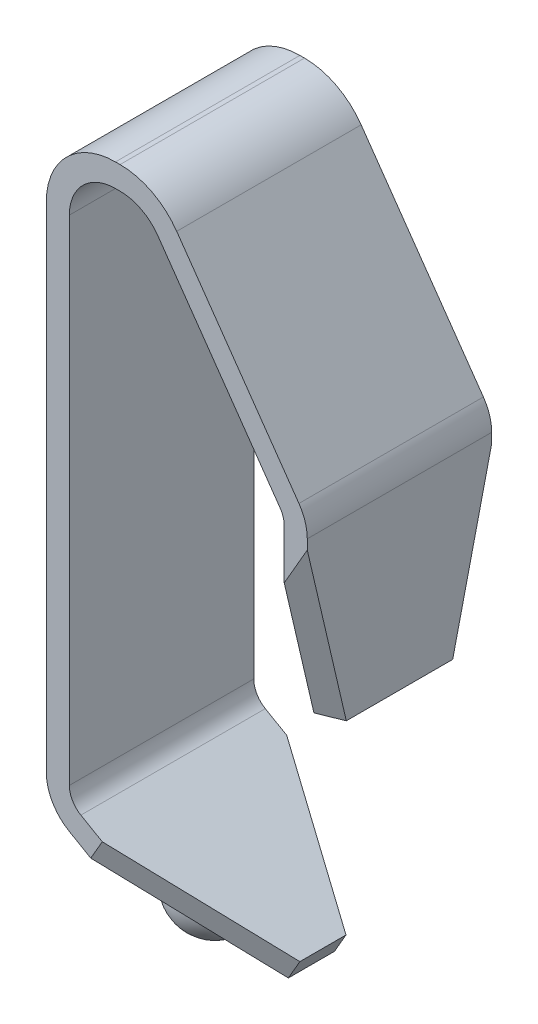
ISO-10303-21;
HEADER;
FILE_DESCRIPTION(('STEP AP214'),'2;1');
FILE_NAME('part.step','',(''),(''),'','','');
FILE_SCHEMA(('AUTOMOTIVE_DESIGN { 1 0 10303 214 1 1 1 1 }'));
ENDSEC;
DATA;
#1=APPLICATION_CONTEXT('core data for automotive mechanical design processes');
#2=APPLICATION_PROTOCOL_DEFINITION('international standard','automotive_design',2000,#1);
#3=PRODUCT_CONTEXT('',#1,'mechanical');
#4=PRODUCT('Part','Part','',(#3));
#5=PRODUCT_RELATED_PRODUCT_CATEGORY('part','',(#4));
#6=PRODUCT_DEFINITION_FORMATION('','',#4);
#7=PRODUCT_DEFINITION_CONTEXT('part definition',#1,'design');
#8=PRODUCT_DEFINITION('design','',#6,#7);
#9=PRODUCT_DEFINITION_SHAPE('','',#8);
#10=(LENGTH_UNIT() NAMED_UNIT(*) SI_UNIT(.MILLI.,.METRE.));
#11=(NAMED_UNIT(*) PLANE_ANGLE_UNIT() SI_UNIT($,.RADIAN.));
#12=(NAMED_UNIT(*) SI_UNIT($,.STERADIAN.) SOLID_ANGLE_UNIT());
#13=UNCERTAINTY_MEASURE_WITH_UNIT(LENGTH_MEASURE(1.E-05),#10,'distance_accuracy_value','');
#14=(GEOMETRIC_REPRESENTATION_CONTEXT(3) GLOBAL_UNCERTAINTY_ASSIGNED_CONTEXT((#13)) GLOBAL_UNIT_ASSIGNED_CONTEXT((#10,
#11,#12)) REPRESENTATION_CONTEXT('',''));
#15=CARTESIAN_POINT('',(0.,0.,0.));
#16=DIRECTION('',(0.,0.,1.));
#17=DIRECTION('',(1.,0.,0.));
#18=AXIS2_PLACEMENT_3D('',#15,#16,#17);
#19=CARTESIAN_POINT('',(0.,-0.577350269189625,2.));
#20=DIRECTION('',(0.500000000000004,0.866025403784436,0.));
#21=DIRECTION('',(-0.866025403784436,0.500000000000004,0.));
#22=AXIS2_PLACEMENT_3D('',#19,#20,#21);
#23=PLANE('',#22);
#24=CARTESIAN_POINT('',(1.48205080756887,-1.43301270189223,0.));
#25=DIRECTION('',(0.500000000000004,0.866025403784436,0.));
#26=DIRECTION('',(-0.866025403784436,0.500000000000004,0.));
#27=AXIS2_PLACEMENT_3D('',#24,#25,#26);
#28=CIRCLE('',#27,0.600000000000012);
#29=CARTESIAN_POINT('',(0.962435565298201,-1.13301270189222,0.));
#30=VERTEX_POINT('',#29);
#31=EDGE_CURVE('E11',#30,#30,#28,.F.);
#32=ORIENTED_EDGE('',*,*,#31,.F.);
#33=EDGE_LOOP('',(#32));
#34=FACE_BOUND('',#33,.T.);
#35=DIRECTION('',(-0.784885567221393,0.453153893518328,-0.4226182617407));
#36=VECTOR('',#35,1.);
#37=CARTESIAN_POINT('',(1.40973756947054,-1.39126263441018,-1.49088139980755));
#38=LINE('',#37,#36);
#39=CARTESIAN_POINT('',(3.25,-2.45373864405593,-0.500000000000001));
#40=VERTEX_POINT('',#39);
#41=CARTESIAN_POINT('',(0.464203792370791,-0.845358453673752,-2.));
#42=VERTEX_POINT('',#41);
#43=EDGE_CURVE('E49',#40,#42,#38,.T.);
#44=ORIENTED_EDGE('',*,*,#43,.F.);
#45=DIRECTION('',(0.,0.,-1.));
#46=VECTOR('',#45,1.);
#47=CARTESIAN_POINT('',(3.25,-2.45373864405593,2.));
#48=LINE('',#47,#46);
#49=CARTESIAN_POINT('',(3.25,-2.45373864405593,0.5));
#50=VERTEX_POINT('',#49);
#51=EDGE_CURVE('E225',#50,#40,#48,.T.);
#52=ORIENTED_EDGE('',*,*,#51,.F.);
#53=DIRECTION('',(0.784885567221396,-0.45315389351833,-0.422618261740694));
#54=VECTOR('',#53,1.);
#55=CARTESIAN_POINT('',(0.0829096731326572,-0.625218191291191,2.20530618043444));
#56=LINE('',#55,#54);
#57=CARTESIAN_POINT('',(0.464203792370743,-0.845358453673718,2.));
#58=VERTEX_POINT('',#57);
#59=EDGE_CURVE('E301',#58,#50,#56,.T.);
#60=ORIENTED_EDGE('',*,*,#59,.F.);
#61=DIRECTION('',(0.866025403784436,-0.500000000000004,0.));
#62=VECTOR('',#61,1.);
#63=CARTESIAN_POINT('',(0.,-0.577350269189625,2.));
#64=LINE('',#63,#62);
#65=CARTESIAN_POINT('',(0.,-0.577350269189625,2.));
#66=VERTEX_POINT('',#65);
#67=EDGE_CURVE('E245',#66,#58,#64,.T.);
#68=ORIENTED_EDGE('',*,*,#67,.F.);
#69=DIRECTION('',(0.,0.,-1.));
#70=VECTOR('',#69,1.);
#71=CARTESIAN_POINT('',(0.,-0.577350269189625,2.));
#72=LINE('',#71,#70);
#73=CARTESIAN_POINT('',(0.,-0.577350269189625,-2.));
#74=VERTEX_POINT('',#73);
#75=EDGE_CURVE('E297',#66,#74,#72,.T.);
#76=ORIENTED_EDGE('',*,*,#75,.T.);
#77=DIRECTION('',(0.866025403784436,-0.500000000000004,0.));
#78=VECTOR('',#77,1.);
#79=CARTESIAN_POINT('',(0.,-0.577350269189625,-2.));
#80=LINE('',#79,#78);
#81=EDGE_CURVE('E298',#74,#42,#80,.T.);
#82=ORIENTED_EDGE('',*,*,#81,.T.);
#83=EDGE_LOOP('',(#44,#52,#60,#68,#76,#82));
#84=FACE_BOUND('',#83,.T.);
#85=ADVANCED_FACE('F35',(#34,#84),#23,.F.);
#86=CARTESIAN_POINT('',(3.5,-2.02072594216371,2.));
#87=DIRECTION('',(0.866025403784437,-0.500000000000003,0.));
#88=DIRECTION('',(0.500000000000003,0.866025403784437,0.));
#89=AXIS2_PLACEMENT_3D('',#86,#87,#88);
#90=PLANE('',#89);
#91=ORIENTED_EDGE('',*,*,#51,.T.);
#92=DIRECTION('',(-0.500000000000004,-0.866025403784436,0.));
#93=VECTOR('',#92,1.);
#94=CARTESIAN_POINT('',(14.1137402657959,16.3628114565341,-0.5));
#95=LINE('',#94,#93);
#96=CARTESIAN_POINT('',(3.5,-2.02072594216371,-0.499999999999999));
#97=VERTEX_POINT('',#96);
#98=EDGE_CURVE('E56',#97,#40,#95,.T.);
#99=ORIENTED_EDGE('',*,*,#98,.F.);
#100=DIRECTION('',(0.,0.,-1.));
#101=VECTOR('',#100,1.);
#102=CARTESIAN_POINT('',(3.5,-2.02072594216371,2.));
#103=LINE('',#102,#101);
#104=CARTESIAN_POINT('',(3.5,-2.02072594216371,0.5));
#105=VERTEX_POINT('',#104);
#106=EDGE_CURVE('E229',#105,#97,#103,.T.);
#107=ORIENTED_EDGE('',*,*,#106,.F.);
#108=DIRECTION('',(-0.500000000000004,-0.866025403784436,0.));
#109=VECTOR('',#108,1.);
#110=CARTESIAN_POINT('',(14.1137402657959,16.3628114565341,0.5));
#111=LINE('',#110,#109);
#112=EDGE_CURVE('E398',#105,#50,#111,.T.);
#113=ORIENTED_EDGE('',*,*,#112,.T.);
#114=EDGE_LOOP('',(#91,#99,#107,#113));
#115=FACE_BOUND('',#114,.T.);
#116=ADVANCED_FACE('F399',(#115),#90,.T.);
#117=CARTESIAN_POINT('',(0.249999999999998,-0.144337567297407,2.));
#118=DIRECTION('',(0.500000000000004,0.866025403784436,0.));
#119=DIRECTION('',(-0.866025403784436,0.500000000000004,0.));
#120=AXIS2_PLACEMENT_3D('',#117,#118,#119);
#121=PLANE('',#120);
#122=ORIENTED_EDGE('',*,*,#106,.T.);
#123=DIRECTION('',(-0.784885567221394,0.453153893518329,-0.4226182617407));
#124=VECTOR('',#123,1.);
#125=CARTESIAN_POINT('',(1.65973756947055,-0.958249932517965,-1.49088139980755));
#126=LINE('',#125,#124);
#127=CARTESIAN_POINT('',(0.714203792370794,-0.412345751781534,-2.));
#128=VERTEX_POINT('',#127);
#129=EDGE_CURVE('E380',#97,#128,#126,.T.);
#130=ORIENTED_EDGE('',*,*,#129,.T.);
#131=DIRECTION('',(0.866025403784436,-0.500000000000004,0.));
#132=VECTOR('',#131,1.);
#133=CARTESIAN_POINT('',(0.249999999999998,-0.144337567297407,-2.));
#134=LINE('',#133,#132);
#135=CARTESIAN_POINT('',(0.249999999999998,-0.144337567297407,-2.));
#136=VERTEX_POINT('',#135);
#137=EDGE_CURVE('E300',#136,#128,#134,.T.);
#138=ORIENTED_EDGE('',*,*,#137,.F.);
#139=DIRECTION('',(0.,0.,-1.));
#140=VECTOR('',#139,1.);
#141=CARTESIAN_POINT('',(0.249999999999998,-0.144337567297407,2.));
#142=LINE('',#141,#140);
#143=CARTESIAN_POINT('',(0.249999999999998,-0.144337567297407,2.));
#144=VERTEX_POINT('',#143);
#145=EDGE_CURVE('E253',#144,#136,#142,.T.);
#146=ORIENTED_EDGE('',*,*,#145,.F.);
#147=DIRECTION('',(0.866025403784436,-0.500000000000004,0.));
#148=VECTOR('',#147,1.);
#149=CARTESIAN_POINT('',(0.249999999999998,-0.144337567297407,2.));
#150=LINE('',#149,#148);
#151=CARTESIAN_POINT('',(0.714203792370743,-0.412345751781505,2.));
#152=VERTEX_POINT('',#151);
#153=EDGE_CURVE('E242',#144,#152,#150,.T.);
#154=ORIENTED_EDGE('',*,*,#153,.T.);
#155=DIRECTION('',(0.784885567221396,-0.45315389351833,-0.422618261740694));
#156=VECTOR('',#155,1.);
#157=CARTESIAN_POINT('',(0.332909673132659,-0.192205489398973,2.20530618043445));
#158=LINE('',#157,#156);
#159=EDGE_CURVE('E251',#152,#105,#158,.T.);
#160=ORIENTED_EDGE('',*,*,#159,.T.);
#161=EDGE_LOOP('',(#122,#130,#138,#146,#154,#160));
#162=FACE_BOUND('',#161,.T.);
#163=ADVANCED_FACE('F250',(#162),#121,.T.);
#164=CARTESIAN_POINT('',(4.66052216321228,7.50084477082885,2.));
#165=DIRECTION('',(-1.,0.,0.));
#166=DIRECTION('',(0.,-1.,0.));
#167=AXIS2_PLACEMENT_3D('',#164,#165,#166);
#168=PLANE('',#167);
#169=DIRECTION('',(0.,1.,0.));
#170=VECTOR('',#169,1.);
#171=CARTESIAN_POINT('',(4.66052216321228,7.50084477082885,-2.));
#172=LINE('',#171,#170);
#173=CARTESIAN_POINT('',(4.66052216321228,6.4228781693583,-2.));
#174=VERTEX_POINT('',#173);
#175=CARTESIAN_POINT('',(4.66052216321228,7.50084477082885,-2.));
#176=VERTEX_POINT('',#175);
#177=EDGE_CURVE('E208',#174,#176,#172,.T.);
#178=ORIENTED_EDGE('',*,*,#177,.F.);
#179=DIRECTION('',(0.,-0.97387987979445,0.227063823035613));
#180=VECTOR('',#179,1.);
#181=CARTESIAN_POINT('',(4.66052216321228,6.56073543590458,-2.03214194956142));
#182=LINE('',#181,#180);
#183=CARTESIAN_POINT('',(4.66052216321228,3.65849416526834,-1.35547328440583));
#184=VERTEX_POINT('',#183);
#185=EDGE_CURVE('E223',#174,#184,#182,.T.);
#186=ORIENTED_EDGE('',*,*,#185,.T.);
#187=DIRECTION('',(0.,0.,-1.));
#188=VECTOR('',#187,1.);
#189=CARTESIAN_POINT('',(4.66052216321228,3.65849416526834,2.));
#190=LINE('',#189,#188);
#191=CARTESIAN_POINT('',(4.66052216321228,3.65849416526834,1.35547328440582));
#192=VERTEX_POINT('',#191);
#193=EDGE_CURVE('E360',#192,#184,#190,.T.);
#194=ORIENTED_EDGE('',*,*,#193,.F.);
#195=DIRECTION('',(0.,0.973879879794451,0.227063823035609));
#196=VECTOR('',#195,1.);
#197=CARTESIAN_POINT('',(4.66052216321228,7.44526699063895,2.23837386848759));
#198=LINE('',#197,#196);
#199=CARTESIAN_POINT('',(4.66052216321228,6.42287816935841,2.));
#200=VERTEX_POINT('',#199);
#201=EDGE_CURVE('E394',#192,#200,#198,.T.);
#202=ORIENTED_EDGE('',*,*,#201,.T.);
#203=DIRECTION('',(0.,1.,0.));
#204=VECTOR('',#203,1.);
#205=CARTESIAN_POINT('',(4.66052216321228,7.50084477082885,2.));
#206=LINE('',#205,#204);
#207=CARTESIAN_POINT('',(4.66052216321228,7.50084477082885,2.));
#208=VERTEX_POINT('',#207);
#209=EDGE_CURVE('E279',#200,#208,#206,.T.);
#210=ORIENTED_EDGE('',*,*,#209,.T.);
#211=DIRECTION('',(0.,0.,-1.));
#212=VECTOR('',#211,1.);
#213=CARTESIAN_POINT('',(4.66052216321228,7.50084477082885,2.));
#214=LINE('',#213,#212);
#215=EDGE_CURVE('E363',#208,#176,#214,.T.);
#216=ORIENTED_EDGE('',*,*,#215,.T.);
#217=EDGE_LOOP('',(#178,#186,#194,#202,#210,#216));
#218=FACE_BOUND('',#217,.T.);
#219=ADVANCED_FACE('F462',(#218),#168,.T.);
#220=CARTESIAN_POINT('',(5.16052216321228,3.65849416526834,2.));
#221=DIRECTION('',(0.,-1.,0.));
#222=DIRECTION('',(0.,0.,-1.));
#223=AXIS2_PLACEMENT_3D('',#220,#221,#222);
#224=PLANE('',#223);
#225=ORIENTED_EDGE('',*,*,#193,.T.);
#226=DIRECTION('',(0.927245660580797,0.,0.374453581814997));
#227=VECTOR('',#226,1.);
#228=CARTESIAN_POINT('',(6.25546983940517,3.65849416526834,-0.71137874123607));
#229=LINE('',#228,#227);
#230=CARTESIAN_POINT('',(5.16052216321228,3.65849416526834,-1.1535561454351));
#231=VERTEX_POINT('',#230);
#232=EDGE_CURVE('E219',#184,#231,#229,.T.);
#233=ORIENTED_EDGE('',*,*,#232,.T.);
#234=DIRECTION('',(0.,0.,-1.));
#235=VECTOR('',#234,1.);
#236=CARTESIAN_POINT('',(5.16052216321228,3.65849416526834,2.));
#237=LINE('',#236,#235);
#238=CARTESIAN_POINT('',(5.16052216321228,3.65849416526834,1.15355614543509));
#239=VERTEX_POINT('',#238);
#240=EDGE_CURVE('E216',#239,#231,#237,.T.);
#241=ORIENTED_EDGE('',*,*,#240,.F.);
#242=DIRECTION('',(-0.9272456605808,0.,0.374453581814991));
#243=VECTOR('',#242,1.);
#244=CARTESIAN_POINT('',(4.8666280040976,3.65849416526834,1.27224068097238));
#245=LINE('',#244,#243);
#246=EDGE_CURVE('E391',#239,#192,#245,.T.);
#247=ORIENTED_EDGE('',*,*,#246,.T.);
#248=EDGE_LOOP('',(#225,#233,#241,#247));
#249=FACE_BOUND('',#248,.T.);
#250=ADVANCED_FACE('F459',(#249),#224,.T.);
#251=CARTESIAN_POINT('',(5.16052216321228,7.50084477082885,2.));
#252=DIRECTION('',(-1.,0.,0.));
#253=DIRECTION('',(0.,-1.,0.));
#254=AXIS2_PLACEMENT_3D('',#251,#252,#253);
#255=PLANE('',#254);
#256=DIRECTION('',(0.,-0.97387987979445,0.227063823035613));
#257=VECTOR('',#256,1.);
#258=CARTESIAN_POINT('',(5.16052216321228,6.6053859561199,-1.8406352503492));
#259=LINE('',#258,#257);
#260=CARTESIAN_POINT('',(5.16052216321228,7.28890357314272,-2.));
#261=VERTEX_POINT('',#260);
#262=EDGE_CURVE('E212',#261,#231,#259,.T.);
#263=ORIENTED_EDGE('',*,*,#262,.F.);
#264=DIRECTION('',(0.,1.,0.));
#265=VECTOR('',#264,1.);
#266=CARTESIAN_POINT('',(5.16052216321228,7.50084477082885,-2.));
#267=LINE('',#266,#265);
#268=CARTESIAN_POINT('',(5.16052216321228,7.50084477082885,-2.));
#269=VERTEX_POINT('',#268);
#270=EDGE_CURVE('E197',#261,#269,#267,.T.);
#271=ORIENTED_EDGE('',*,*,#270,.T.);
#272=DIRECTION('',(0.,0.,-1.));
#273=VECTOR('',#272,1.);
#274=CARTESIAN_POINT('',(5.16052216321228,7.50084477082885,2.));
#275=LINE('',#274,#273);
#276=CARTESIAN_POINT('',(5.16052216321228,7.50084477082885,2.));
#277=VERTEX_POINT('',#276);
#278=EDGE_CURVE('E357',#277,#269,#275,.T.);
#279=ORIENTED_EDGE('',*,*,#278,.F.);
#280=DIRECTION('',(0.,1.,0.));
#281=VECTOR('',#280,1.);
#282=CARTESIAN_POINT('',(5.16052216321228,7.50084477082885,2.));
#283=LINE('',#282,#281);
#284=CARTESIAN_POINT('',(5.16052216321228,7.28890357314284,2.));
#285=VERTEX_POINT('',#284);
#286=EDGE_CURVE('E281',#285,#277,#283,.T.);
#287=ORIENTED_EDGE('',*,*,#286,.F.);
#288=DIRECTION('',(0.,0.973879879794451,0.227063823035609));
#289=VECTOR('',#288,1.);
#290=CARTESIAN_POINT('',(5.16052216321228,7.48991751085427,2.04686716927537));
#291=LINE('',#290,#289);
#292=EDGE_CURVE('E385',#239,#285,#291,.T.);
#293=ORIENTED_EDGE('',*,*,#292,.F.);
#294=ORIENTED_EDGE('',*,*,#240,.T.);
#295=EDGE_LOOP('',(#263,#271,#279,#287,#293,#294));
#296=FACE_BOUND('',#295,.T.);
#297=ADVANCED_FACE('F213',(#296),#255,.F.);
#298=CARTESIAN_POINT('',(0.5,0.288675134594811,2.));
#299=DIRECTION('',(0.,0.,1.));
#300=DIRECTION('',(1.,0.,0.));
#301=AXIS2_PLACEMENT_3D('',#298,#299,#300);
#302=PLANE('',#301);
#303=ORIENTED_EDGE('',*,*,#67,.T.);
#304=DIRECTION('',(0.500000000000004,0.866025403784436,0.));
#305=VECTOR('',#304,1.);
#306=CARTESIAN_POINT('',(0.964203792370745,0.0206669501107136,2.));
#307=LINE('',#306,#305);
#308=EDGE_CURVE('E42',#58,#152,#307,.T.);
#309=ORIENTED_EDGE('',*,*,#308,.T.);
#310=ORIENTED_EDGE('',*,*,#153,.F.);
#311=CARTESIAN_POINT('',(0.5,0.288675134594811,2.));
#312=DIRECTION('',(0.,0.,1.));
#313=DIRECTION('',(1.,0.,0.));
#314=AXIS2_PLACEMENT_3D('',#311,#312,#313);
#315=CIRCLE('',#314,0.5);
#316=CARTESIAN_POINT('',(0.,0.288675134594811,2.));
#317=VERTEX_POINT('',#316);
#318=EDGE_CURVE('E254',#317,#144,#315,.T.);
#319=ORIENTED_EDGE('',*,*,#318,.F.);
#320=DIRECTION('',(0.,-1.,0.));
#321=VECTOR('',#320,1.);
#322=CARTESIAN_POINT('',(0.,0.288675134594811,2.));
#323=LINE('',#322,#321);
#324=CARTESIAN_POINT('',(0.,11.,2.));
#325=VERTEX_POINT('',#324);
#326=EDGE_CURVE('E256',#325,#317,#323,.T.);
#327=ORIENTED_EDGE('',*,*,#326,.F.);
#328=CARTESIAN_POINT('',(1.,11.,2.));
#329=DIRECTION('',(0.,0.,1.));
#330=DIRECTION('',(-1.,0.,0.));
#331=AXIS2_PLACEMENT_3D('',#328,#329,#330);
#332=CIRCLE('',#331,1.);
#333=CARTESIAN_POINT('',(1.00000000000001,12.,2.));
#334=VERTEX_POINT('',#333);
#335=EDGE_CURVE('E264',#334,#325,#332,.T.);
#336=ORIENTED_EDGE('',*,*,#335,.F.);
#337=DIRECTION('',(-1.,0.,0.));
#338=VECTOR('',#337,1.);
#339=CARTESIAN_POINT('',(1.00000000000001,12.,2.));
#340=LINE('',#339,#338);
#341=CARTESIAN_POINT('',(1.1,12.,2.));
#342=VERTEX_POINT('',#341);
#343=EDGE_CURVE('E267',#342,#334,#340,.T.);
#344=ORIENTED_EDGE('',*,*,#343,.F.);
#345=CARTESIAN_POINT('',(1.1,11.,2.));
#346=DIRECTION('',(0.,0.,1.));
#347=DIRECTION('',(-1.,0.,0.));
#348=AXIS2_PLACEMENT_3D('',#345,#346,#347);
#349=CIRCLE('',#348,1.);
#350=CARTESIAN_POINT('',(1.91915204428899,11.573576436351,2.));
#351=VERTEX_POINT('',#350);
#352=EDGE_CURVE('E270',#351,#342,#349,.T.);
#353=ORIENTED_EDGE('',*,*,#352,.F.);
#354=DIRECTION('',(-0.573576436351044,0.819152044288993,0.));
#355=VECTOR('',#354,1.);
#356=CARTESIAN_POINT('',(1.91915204428899,11.573576436351,2.));
#357=LINE('',#356,#355);
#358=CARTESIAN_POINT('',(4.57009818535678,7.78763298900437,2.));
#359=VERTEX_POINT('',#358);
#360=EDGE_CURVE('E273',#359,#351,#357,.T.);
#361=ORIENTED_EDGE('',*,*,#360,.F.);
#362=CARTESIAN_POINT('',(4.16052216321228,7.50084477082885,2.));
#363=DIRECTION('',(0.,0.,1.));
#364=DIRECTION('',(-1.,0.,0.));
#365=AXIS2_PLACEMENT_3D('',#362,#363,#364);
#366=CIRCLE('',#365,0.5);
#367=EDGE_CURVE('E276',#208,#359,#366,.T.);
#368=ORIENTED_EDGE('',*,*,#367,.F.);
#369=ORIENTED_EDGE('',*,*,#209,.F.);
#370=EDGE_CURVE('E228',#200,#285,#307,.T.);
#371=ORIENTED_EDGE('',*,*,#370,.T.);
#372=ORIENTED_EDGE('',*,*,#286,.T.);
#373=CARTESIAN_POINT('',(4.16052216321228,7.50084477082885,2.));
#374=DIRECTION('',(0.,0.,1.));
#375=DIRECTION('',(1.,0.,0.));
#376=AXIS2_PLACEMENT_3D('',#373,#374,#375);
#377=CIRCLE('',#376,1.);
#378=CARTESIAN_POINT('',(4.97967420750128,8.07442120717989,2.));
#379=VERTEX_POINT('',#378);
#380=EDGE_CURVE('E283',#277,#379,#377,.T.);
#381=ORIENTED_EDGE('',*,*,#380,.T.);
#382=DIRECTION('',(-0.573576436351044,0.819152044288993,0.));
#383=VECTOR('',#382,1.);
#384=CARTESIAN_POINT('',(2.32872806643349,11.8603646545266,2.));
#385=LINE('',#384,#383);
#386=CARTESIAN_POINT('',(2.32872806643349,11.8603646545266,2.));
#387=VERTEX_POINT('',#386);
#388=EDGE_CURVE('E285',#379,#387,#385,.T.);
#389=ORIENTED_EDGE('',*,*,#388,.T.);
#390=CARTESIAN_POINT('',(1.1,11.,2.));
#391=DIRECTION('',(0.,0.,1.));
#392=DIRECTION('',(1.,0.,0.));
#393=AXIS2_PLACEMENT_3D('',#390,#391,#392);
#394=CIRCLE('',#393,1.5);
#395=CARTESIAN_POINT('',(1.1,12.5,2.));
#396=VERTEX_POINT('',#395);
#397=EDGE_CURVE('E287',#387,#396,#394,.T.);
#398=ORIENTED_EDGE('',*,*,#397,.T.);
#399=DIRECTION('',(1.,0.,0.));
#400=VECTOR('',#399,1.);
#401=CARTESIAN_POINT('',(1.00000000000001,12.5,2.));
#402=LINE('',#401,#400);
#403=CARTESIAN_POINT('',(1.00000000000001,12.5,2.));
#404=VERTEX_POINT('',#403);
#405=EDGE_CURVE('E289',#396,#404,#402,.F.);
#406=ORIENTED_EDGE('',*,*,#405,.T.);
#407=CARTESIAN_POINT('',(1.,11.,2.));
#408=DIRECTION('',(0.,0.,1.));
#409=DIRECTION('',(1.,0.,0.));
#410=AXIS2_PLACEMENT_3D('',#407,#408,#409);
#411=CIRCLE('',#410,1.5);
#412=CARTESIAN_POINT('',(-0.5,11.,2.));
#413=VERTEX_POINT('',#412);
#414=EDGE_CURVE('E291',#404,#413,#411,.T.);
#415=ORIENTED_EDGE('',*,*,#414,.T.);
#416=DIRECTION('',(0.,1.,0.));
#417=VECTOR('',#416,1.);
#418=CARTESIAN_POINT('',(-0.5,0.288675134594811,2.));
#419=LINE('',#418,#417);
#420=CARTESIAN_POINT('',(-0.5,0.288675134594811,2.));
#421=VERTEX_POINT('',#420);
#422=EDGE_CURVE('E293',#413,#421,#419,.F.);
#423=ORIENTED_EDGE('',*,*,#422,.T.);
#424=CARTESIAN_POINT('',(0.5,0.288675134594811,2.));
#425=DIRECTION('',(0.,0.,1.));
#426=DIRECTION('',(1.,0.,0.));
#427=AXIS2_PLACEMENT_3D('',#424,#425,#426);
#428=CIRCLE('',#427,1.);
#429=EDGE_CURVE('E295',#421,#66,#428,.T.);
#430=ORIENTED_EDGE('',*,*,#429,.T.);
#431=EDGE_LOOP('',(#303,#309,#310,#319,#327,#336,#344,#353,#361,#368,#369,#371,#372,#381,#389,
#398,#406,#415,#423,#430));
#432=FACE_BOUND('',#431,.T.);
#433=ADVANCED_FACE('F240',(#432),#302,.T.);
#434=CARTESIAN_POINT('',(0.5,0.288675134594811,-2.));
#435=DIRECTION('',(0.,0.,1.));
#436=DIRECTION('',(1.,0.,0.));
#437=AXIS2_PLACEMENT_3D('',#434,#435,#436);
#438=PLANE('',#437);
#439=DIRECTION('',(0.500000000000004,0.866025403784436,0.));
#440=VECTOR('',#439,1.);
#441=CARTESIAN_POINT('',(0.964203792370795,0.0206669501106849,-2.));
#442=LINE('',#441,#440);
#443=EDGE_CURVE('E224',#42,#128,#442,.T.);
#444=ORIENTED_EDGE('',*,*,#443,.F.);
#445=ORIENTED_EDGE('',*,*,#81,.F.);
#446=CARTESIAN_POINT('',(0.5,0.288675134594811,-2.));
#447=DIRECTION('',(0.,0.,1.));
#448=DIRECTION('',(1.,0.,0.));
#449=AXIS2_PLACEMENT_3D('',#446,#447,#448);
#450=CIRCLE('',#449,1.);
#451=CARTESIAN_POINT('',(-0.5,0.288675134594811,-2.));
#452=VERTEX_POINT('',#451);
#453=EDGE_CURVE('E258',#452,#74,#450,.T.);
#454=ORIENTED_EDGE('',*,*,#453,.F.);
#455=DIRECTION('',(0.,1.,0.));
#456=VECTOR('',#455,1.);
#457=CARTESIAN_POINT('',(-0.5,0.288675134594811,-2.));
#458=LINE('',#457,#456);
#459=CARTESIAN_POINT('',(-0.5,11.,-2.));
#460=VERTEX_POINT('',#459);
#461=EDGE_CURVE('E334',#460,#452,#458,.F.);
#462=ORIENTED_EDGE('',*,*,#461,.F.);
#463=CARTESIAN_POINT('',(1.,11.,-2.));
#464=DIRECTION('',(0.,0.,1.));
#465=DIRECTION('',(1.,0.,0.));
#466=AXIS2_PLACEMENT_3D('',#463,#464,#465);
#467=CIRCLE('',#466,1.5);
#468=CARTESIAN_POINT('',(1.00000000000001,12.5,-2.));
#469=VERTEX_POINT('',#468);
#470=EDGE_CURVE('E332',#469,#460,#467,.T.);
#471=ORIENTED_EDGE('',*,*,#470,.F.);
#472=DIRECTION('',(1.,0.,0.));
#473=VECTOR('',#472,1.);
#474=CARTESIAN_POINT('',(1.00000000000001,12.5,-2.));
#475=LINE('',#474,#473);
#476=CARTESIAN_POINT('',(1.1,12.5,-2.));
#477=VERTEX_POINT('',#476);
#478=EDGE_CURVE('E330',#477,#469,#475,.F.);
#479=ORIENTED_EDGE('',*,*,#478,.F.);
#480=CARTESIAN_POINT('',(1.1,11.,-2.));
#481=DIRECTION('',(0.,0.,1.));
#482=DIRECTION('',(1.,0.,0.));
#483=AXIS2_PLACEMENT_3D('',#480,#481,#482);
#484=CIRCLE('',#483,1.5);
#485=CARTESIAN_POINT('',(2.32872806643349,11.8603646545266,-2.));
#486=VERTEX_POINT('',#485);
#487=EDGE_CURVE('E328',#486,#477,#484,.T.);
#488=ORIENTED_EDGE('',*,*,#487,.F.);
#489=DIRECTION('',(-0.573576436351044,0.819152044288993,0.));
#490=VECTOR('',#489,1.);
#491=CARTESIAN_POINT('',(2.32872806643349,11.8603646545266,-2.));
#492=LINE('',#491,#490);
#493=CARTESIAN_POINT('',(4.97967420750128,8.07442120717989,-2.));
#494=VERTEX_POINT('',#493);
#495=EDGE_CURVE('E326',#494,#486,#492,.T.);
#496=ORIENTED_EDGE('',*,*,#495,.F.);
#497=CARTESIAN_POINT('',(4.16052216321228,7.50084477082885,-2.));
#498=DIRECTION('',(0.,0.,1.));
#499=DIRECTION('',(1.,0.,0.));
#500=AXIS2_PLACEMENT_3D('',#497,#498,#499);
#501=CIRCLE('',#500,1.);
#502=EDGE_CURVE('E204',#269,#494,#501,.T.);
#503=ORIENTED_EDGE('',*,*,#502,.F.);
#504=ORIENTED_EDGE('',*,*,#270,.F.);
#505=EDGE_CURVE('E201',#174,#261,#442,.T.);
#506=ORIENTED_EDGE('',*,*,#505,.F.);
#507=ORIENTED_EDGE('',*,*,#177,.T.);
#508=CARTESIAN_POINT('',(4.16052216321228,7.50084477082885,-2.));
#509=DIRECTION('',(0.,0.,1.));
#510=DIRECTION('',(-1.,0.,0.));
#511=AXIS2_PLACEMENT_3D('',#508,#509,#510);
#512=CIRCLE('',#511,0.5);
#513=CARTESIAN_POINT('',(4.57009818535678,7.78763298900437,-2.));
#514=VERTEX_POINT('',#513);
#515=EDGE_CURVE('E321',#176,#514,#512,.T.);
#516=ORIENTED_EDGE('',*,*,#515,.T.);
#517=DIRECTION('',(-0.573576436351044,0.819152044288993,0.));
#518=VECTOR('',#517,1.);
#519=CARTESIAN_POINT('',(1.91915204428899,11.573576436351,-2.));
#520=LINE('',#519,#518);
#521=CARTESIAN_POINT('',(1.91915204428899,11.573576436351,-2.));
#522=VERTEX_POINT('',#521);
#523=EDGE_CURVE('E318',#514,#522,#520,.T.);
#524=ORIENTED_EDGE('',*,*,#523,.T.);
#525=CARTESIAN_POINT('',(1.1,11.,-2.));
#526=DIRECTION('',(0.,0.,1.));
#527=DIRECTION('',(-1.,0.,0.));
#528=AXIS2_PLACEMENT_3D('',#525,#526,#527);
#529=CIRCLE('',#528,1.);
#530=CARTESIAN_POINT('',(1.1,12.,-2.));
#531=VERTEX_POINT('',#530);
#532=EDGE_CURVE('E315',#522,#531,#529,.T.);
#533=ORIENTED_EDGE('',*,*,#532,.T.);
#534=DIRECTION('',(-1.,0.,0.));
#535=VECTOR('',#534,1.);
#536=CARTESIAN_POINT('',(1.00000000000001,12.,-2.));
#537=LINE('',#536,#535);
#538=CARTESIAN_POINT('',(1.00000000000001,12.,-2.));
#539=VERTEX_POINT('',#538);
#540=EDGE_CURVE('E312',#531,#539,#537,.T.);
#541=ORIENTED_EDGE('',*,*,#540,.T.);
#542=CARTESIAN_POINT('',(1.,11.,-2.));
#543=DIRECTION('',(0.,0.,1.));
#544=DIRECTION('',(-1.,0.,0.));
#545=AXIS2_PLACEMENT_3D('',#542,#543,#544);
#546=CIRCLE('',#545,1.);
#547=CARTESIAN_POINT('',(0.,11.,-2.));
#548=VERTEX_POINT('',#547);
#549=EDGE_CURVE('E309',#539,#548,#546,.T.);
#550=ORIENTED_EDGE('',*,*,#549,.T.);
#551=DIRECTION('',(0.,-1.,0.));
#552=VECTOR('',#551,1.);
#553=CARTESIAN_POINT('',(0.,0.288675134594811,-2.));
#554=LINE('',#553,#552);
#555=CARTESIAN_POINT('',(0.,0.288675134594811,-2.));
#556=VERTEX_POINT('',#555);
#557=EDGE_CURVE('E306',#548,#556,#554,.T.);
#558=ORIENTED_EDGE('',*,*,#557,.T.);
#559=CARTESIAN_POINT('',(0.5,0.288675134594811,-2.));
#560=DIRECTION('',(0.,0.,1.));
#561=DIRECTION('',(1.,0.,0.));
#562=AXIS2_PLACEMENT_3D('',#559,#560,#561);
#563=CIRCLE('',#562,0.5);
#564=EDGE_CURVE('E303',#556,#136,#563,.T.);
#565=ORIENTED_EDGE('',*,*,#564,.T.);
#566=ORIENTED_EDGE('',*,*,#137,.T.);
#567=EDGE_LOOP('',(#444,#445,#454,#462,#471,#479,#488,#496,#503,#504,#506,#507,#516,#524,#533,
#541,#550,#558,#565,#566));
#568=FACE_BOUND('',#567,.T.);
#569=ADVANCED_FACE('F199',(#568),#438,.F.);
#570=CARTESIAN_POINT('',(0.5,0.288675134594811,2.));
#571=DIRECTION('',(0.,0.,-1.));
#572=DIRECTION('',(-1.,0.,0.));
#573=AXIS2_PLACEMENT_3D('',#570,#571,#572);
#574=CYLINDRICAL_SURFACE('',#573,0.5);
#575=ORIENTED_EDGE('',*,*,#564,.F.);
#576=DIRECTION('',(0.,0.,-1.));
#577=VECTOR('',#576,1.);
#578=CARTESIAN_POINT('',(0.,0.288675134594811,2.));
#579=LINE('',#578,#577);
#580=EDGE_CURVE('E376',#317,#556,#579,.T.);
#581=ORIENTED_EDGE('',*,*,#580,.F.);
#582=ORIENTED_EDGE('',*,*,#318,.T.);
#583=ORIENTED_EDGE('',*,*,#145,.T.);
#584=EDGE_LOOP('',(#575,#581,#582,#583));
#585=FACE_BOUND('',#584,.T.);
#586=ADVANCED_FACE('F428',(#585),#574,.F.);
#587=CARTESIAN_POINT('',(0.,0.288675134594811,2.));
#588=DIRECTION('',(1.,0.,0.));
#589=DIRECTION('',(0.,0.,-1.));
#590=AXIS2_PLACEMENT_3D('',#587,#588,#589);
#591=PLANE('',#590);
#592=ORIENTED_EDGE('',*,*,#557,.F.);
#593=DIRECTION('',(0.,0.,-1.));
#594=VECTOR('',#593,1.);
#595=CARTESIAN_POINT('',(0.,11.,2.));
#596=LINE('',#595,#594);
#597=EDGE_CURVE('E374',#325,#548,#596,.T.);
#598=ORIENTED_EDGE('',*,*,#597,.F.);
#599=ORIENTED_EDGE('',*,*,#326,.T.);
#600=ORIENTED_EDGE('',*,*,#580,.T.);
#601=EDGE_LOOP('',(#592,#598,#599,#600));
#602=FACE_BOUND('',#601,.T.);
#603=ADVANCED_FACE('F485',(#602),#591,.T.);
#604=CARTESIAN_POINT('',(1.,11.,2.));
#605=DIRECTION('',(0.,0.,-1.));
#606=DIRECTION('',(-1.,0.,0.));
#607=AXIS2_PLACEMENT_3D('',#604,#605,#606);
#608=CYLINDRICAL_SURFACE('',#607,1.);
#609=ORIENTED_EDGE('',*,*,#549,.F.);
#610=DIRECTION('',(0.,0.,-1.));
#611=VECTOR('',#610,1.);
#612=CARTESIAN_POINT('',(1.00000000000001,12.,2.));
#613=LINE('',#612,#611);
#614=EDGE_CURVE('E372',#334,#539,#613,.T.);
#615=ORIENTED_EDGE('',*,*,#614,.F.);
#616=ORIENTED_EDGE('',*,*,#335,.T.);
#617=ORIENTED_EDGE('',*,*,#597,.T.);
#618=EDGE_LOOP('',(#609,#615,#616,#617));
#619=FACE_BOUND('',#618,.T.);
#620=ADVANCED_FACE('F481',(#619),#608,.F.);
#621=CARTESIAN_POINT('',(1.00000000000001,12.,2.));
#622=DIRECTION('',(0.,-1.,0.));
#623=DIRECTION('',(0.,0.,-1.));
#624=AXIS2_PLACEMENT_3D('',#621,#622,#623);
#625=PLANE('',#624);
#626=ORIENTED_EDGE('',*,*,#540,.F.);
#627=DIRECTION('',(0.,0.,-1.));
#628=VECTOR('',#627,1.);
#629=CARTESIAN_POINT('',(1.1,12.,2.));
#630=LINE('',#629,#628);
#631=EDGE_CURVE('E370',#342,#531,#630,.T.);
#632=ORIENTED_EDGE('',*,*,#631,.F.);
#633=ORIENTED_EDGE('',*,*,#343,.T.);
#634=ORIENTED_EDGE('',*,*,#614,.T.);
#635=EDGE_LOOP('',(#626,#632,#633,#634));
#636=FACE_BOUND('',#635,.T.);
#637=ADVANCED_FACE('F477',(#636),#625,.T.);
#638=CARTESIAN_POINT('',(1.1,11.,2.));
#639=DIRECTION('',(0.,0.,-1.));
#640=DIRECTION('',(-1.,0.,0.));
#641=AXIS2_PLACEMENT_3D('',#638,#639,#640);
#642=CYLINDRICAL_SURFACE('',#641,1.);
#643=ORIENTED_EDGE('',*,*,#532,.F.);
#644=DIRECTION('',(0.,0.,-1.));
#645=VECTOR('',#644,1.);
#646=CARTESIAN_POINT('',(1.91915204428899,11.573576436351,2.));
#647=LINE('',#646,#645);
#648=EDGE_CURVE('E368',#351,#522,#647,.T.);
#649=ORIENTED_EDGE('',*,*,#648,.F.);
#650=ORIENTED_EDGE('',*,*,#352,.T.);
#651=ORIENTED_EDGE('',*,*,#631,.T.);
#652=EDGE_LOOP('',(#643,#649,#650,#651));
#653=FACE_BOUND('',#652,.T.);
#654=ADVANCED_FACE('F473',(#653),#642,.F.);
#655=CARTESIAN_POINT('',(1.91915204428899,11.573576436351,2.));
#656=DIRECTION('',(-0.819152044288993,-0.573576436351044,0.));
#657=DIRECTION('',(0.573576436351044,-0.819152044288993,0.));
#658=AXIS2_PLACEMENT_3D('',#655,#656,#657);
#659=PLANE('',#658);
#660=ORIENTED_EDGE('',*,*,#523,.F.);
#661=DIRECTION('',(0.,0.,-1.));
#662=VECTOR('',#661,1.);
#663=CARTESIAN_POINT('',(4.57009818535678,7.78763298900437,2.));
#664=LINE('',#663,#662);
#665=EDGE_CURVE('E366',#359,#514,#664,.T.);
#666=ORIENTED_EDGE('',*,*,#665,.F.);
#667=ORIENTED_EDGE('',*,*,#360,.T.);
#668=ORIENTED_EDGE('',*,*,#648,.T.);
#669=EDGE_LOOP('',(#660,#666,#667,#668));
#670=FACE_BOUND('',#669,.T.);
#671=ADVANCED_FACE('F469',(#670),#659,.T.);
#672=CARTESIAN_POINT('',(4.16052216321228,7.50084477082885,2.));
#673=DIRECTION('',(0.,0.,-1.));
#674=DIRECTION('',(-1.,0.,0.));
#675=AXIS2_PLACEMENT_3D('',#672,#673,#674);
#676=CYLINDRICAL_SURFACE('',#675,0.5);
#677=ORIENTED_EDGE('',*,*,#515,.F.);
#678=ORIENTED_EDGE('',*,*,#215,.F.);
#679=ORIENTED_EDGE('',*,*,#367,.T.);
#680=ORIENTED_EDGE('',*,*,#665,.T.);
#681=EDGE_LOOP('',(#677,#678,#679,#680));
#682=FACE_BOUND('',#681,.T.);
#683=ADVANCED_FACE('F455',(#682),#676,.F.);
#684=CARTESIAN_POINT('',(4.16052216321228,7.50084477082885,2.));
#685=DIRECTION('',(0.,0.,-1.));
#686=DIRECTION('',(-1.,0.,0.));
#687=AXIS2_PLACEMENT_3D('',#684,#685,#686);
#688=CYLINDRICAL_SURFACE('',#687,1.);
#689=ORIENTED_EDGE('',*,*,#502,.T.);
#690=DIRECTION('',(0.,0.,-1.));
#691=VECTOR('',#690,1.);
#692=CARTESIAN_POINT('',(4.97967420750128,8.07442120717989,2.));
#693=LINE('',#692,#691);
#694=EDGE_CURVE('E354',#379,#494,#693,.T.);
#695=ORIENTED_EDGE('',*,*,#694,.F.);
#696=ORIENTED_EDGE('',*,*,#380,.F.);
#697=ORIENTED_EDGE('',*,*,#278,.T.);
#698=EDGE_LOOP('',(#689,#695,#696,#697));
#699=FACE_BOUND('',#698,.T.);
#700=ADVANCED_FACE('F451',(#699),#688,.T.);
#701=CARTESIAN_POINT('',(2.32872806643349,11.8603646545266,2.));
#702=DIRECTION('',(-0.819152044288993,-0.573576436351044,0.));
#703=DIRECTION('',(0.573576436351044,-0.819152044288993,0.));
#704=AXIS2_PLACEMENT_3D('',#701,#702,#703);
#705=PLANE('',#704);
#706=ORIENTED_EDGE('',*,*,#495,.T.);
#707=DIRECTION('',(0.,0.,-1.));
#708=VECTOR('',#707,1.);
#709=CARTESIAN_POINT('',(2.32872806643349,11.8603646545266,2.));
#710=LINE('',#709,#708);
#711=EDGE_CURVE('E351',#387,#486,#710,.T.);
#712=ORIENTED_EDGE('',*,*,#711,.F.);
#713=ORIENTED_EDGE('',*,*,#388,.F.);
#714=ORIENTED_EDGE('',*,*,#694,.T.);
#715=EDGE_LOOP('',(#706,#712,#713,#714));
#716=FACE_BOUND('',#715,.T.);
#717=ADVANCED_FACE('F447',(#716),#705,.F.);
#718=CARTESIAN_POINT('',(1.1,11.,2.));
#719=DIRECTION('',(0.,0.,-1.));
#720=DIRECTION('',(-1.,0.,0.));
#721=AXIS2_PLACEMENT_3D('',#718,#719,#720);
#722=CYLINDRICAL_SURFACE('',#721,1.5);
#723=ORIENTED_EDGE('',*,*,#487,.T.);
#724=DIRECTION('',(0.,0.,-1.));
#725=VECTOR('',#724,1.);
#726=CARTESIAN_POINT('',(1.1,12.5,2.));
#727=LINE('',#726,#725);
#728=EDGE_CURVE('E348',#396,#477,#727,.T.);
#729=ORIENTED_EDGE('',*,*,#728,.F.);
#730=ORIENTED_EDGE('',*,*,#397,.F.);
#731=ORIENTED_EDGE('',*,*,#711,.T.);
#732=EDGE_LOOP('',(#723,#729,#730,#731));
#733=FACE_BOUND('',#732,.T.);
#734=ADVANCED_FACE('F443',(#733),#722,.T.);
#735=CARTESIAN_POINT('',(1.00000000000001,12.5,2.));
#736=DIRECTION('',(0.,-1.,0.));
#737=DIRECTION('',(0.,0.,-1.));
#738=AXIS2_PLACEMENT_3D('',#735,#736,#737);
#739=PLANE('',#738);
#740=ORIENTED_EDGE('',*,*,#478,.T.);
#741=DIRECTION('',(0.,0.,-1.));
#742=VECTOR('',#741,1.);
#743=CARTESIAN_POINT('',(1.00000000000001,12.5,2.));
#744=LINE('',#743,#742);
#745=EDGE_CURVE('E345',#404,#469,#744,.T.);
#746=ORIENTED_EDGE('',*,*,#745,.F.);
#747=ORIENTED_EDGE('',*,*,#405,.F.);
#748=ORIENTED_EDGE('',*,*,#728,.T.);
#749=EDGE_LOOP('',(#740,#746,#747,#748));
#750=FACE_BOUND('',#749,.T.);
#751=ADVANCED_FACE('F439',(#750),#739,.F.);
#752=CARTESIAN_POINT('',(1.,11.,2.));
#753=DIRECTION('',(0.,0.,-1.));
#754=DIRECTION('',(-1.,0.,0.));
#755=AXIS2_PLACEMENT_3D('',#752,#753,#754);
#756=CYLINDRICAL_SURFACE('',#755,1.5);
#757=ORIENTED_EDGE('',*,*,#470,.T.);
#758=DIRECTION('',(0.,0.,-1.));
#759=VECTOR('',#758,1.);
#760=CARTESIAN_POINT('',(-0.5,11.,2.));
#761=LINE('',#760,#759);
#762=EDGE_CURVE('E342',#413,#460,#761,.T.);
#763=ORIENTED_EDGE('',*,*,#762,.F.);
#764=ORIENTED_EDGE('',*,*,#414,.F.);
#765=ORIENTED_EDGE('',*,*,#745,.T.);
#766=EDGE_LOOP('',(#757,#763,#764,#765));
#767=FACE_BOUND('',#766,.T.);
#768=ADVANCED_FACE('F435',(#767),#756,.T.);
#769=CARTESIAN_POINT('',(-0.5,0.288675134594811,2.));
#770=DIRECTION('',(1.,0.,0.));
#771=DIRECTION('',(0.,0.,-1.));
#772=AXIS2_PLACEMENT_3D('',#769,#770,#771);
#773=PLANE('',#772);
#774=ORIENTED_EDGE('',*,*,#461,.T.);
#775=DIRECTION('',(0.,0.,-1.));
#776=VECTOR('',#775,1.);
#777=CARTESIAN_POINT('',(-0.5,0.288675134594811,2.));
#778=LINE('',#777,#776);
#779=EDGE_CURVE('E339',#421,#452,#778,.T.);
#780=ORIENTED_EDGE('',*,*,#779,.F.);
#781=ORIENTED_EDGE('',*,*,#422,.F.);
#782=ORIENTED_EDGE('',*,*,#762,.T.);
#783=EDGE_LOOP('',(#774,#780,#781,#782));
#784=FACE_BOUND('',#783,.T.);
#785=ADVANCED_FACE('F431',(#784),#773,.F.);
#786=CARTESIAN_POINT('',(0.5,0.288675134594811,2.));
#787=DIRECTION('',(0.,0.,-1.));
#788=DIRECTION('',(-1.,0.,0.));
#789=AXIS2_PLACEMENT_3D('',#786,#787,#788);
#790=CYLINDRICAL_SURFACE('',#789,1.);
#791=ORIENTED_EDGE('',*,*,#453,.T.);
#792=ORIENTED_EDGE('',*,*,#75,.F.);
#793=ORIENTED_EDGE('',*,*,#429,.F.);
#794=ORIENTED_EDGE('',*,*,#779,.T.);
#795=EDGE_LOOP('',(#791,#792,#793,#794));
#796=FACE_BOUND('',#795,.T.);
#797=ADVANCED_FACE('F423',(#796),#790,.T.);
#798=CARTESIAN_POINT('',(11.3279440581666,17.9711916469163,-2.));
#799=DIRECTION('',(0.365998150770666,-0.211309130870352,-0.90630778703665));
#800=DIRECTION('',(-0.927245660580797,0.,-0.374453581814997));
#801=AXIS2_PLACEMENT_3D('',#798,#799,#800);
#802=PLANE('',#801);
#803=ORIENTED_EDGE('',*,*,#185,.F.);
#804=ORIENTED_EDGE('',*,*,#505,.T.);
#805=ORIENTED_EDGE('',*,*,#262,.T.);
#806=ORIENTED_EDGE('',*,*,#232,.F.);
#807=EDGE_LOOP('',(#803,#804,#805,#806));
#808=FACE_BOUND('',#807,.T.);
#809=ADVANCED_FACE('F222',(#808),#802,.T.);
#810=ORIENTED_EDGE('',*,*,#98,.T.);
#811=ORIENTED_EDGE('',*,*,#43,.T.);
#812=ORIENTED_EDGE('',*,*,#443,.T.);
#813=ORIENTED_EDGE('',*,*,#129,.F.);
#814=EDGE_LOOP('',(#810,#811,#812,#813));
#815=FACE_BOUND('',#814,.T.);
#816=ADVANCED_FACE('F383',(#815),#802,.T.);
#817=CARTESIAN_POINT('',(14.1137402657959,16.3628114565341,0.5));
#818=DIRECTION('',(0.365998150770661,-0.211309130870349,0.906307787036653));
#819=DIRECTION('',(0.9272456605808,0.,-0.374453581814991));
#820=AXIS2_PLACEMENT_3D('',#817,#818,#819);
#821=PLANE('',#820);
#822=ORIENTED_EDGE('',*,*,#201,.F.);
#823=ORIENTED_EDGE('',*,*,#246,.F.);
#824=ORIENTED_EDGE('',*,*,#292,.T.);
#825=ORIENTED_EDGE('',*,*,#370,.F.);
#826=EDGE_LOOP('',(#822,#823,#824,#825));
#827=FACE_BOUND('',#826,.T.);
#828=ADVANCED_FACE('F416',(#827),#821,.T.);
#829=ORIENTED_EDGE('',*,*,#308,.F.);
#830=ORIENTED_EDGE('',*,*,#59,.T.);
#831=ORIENTED_EDGE('',*,*,#112,.F.);
#832=ORIENTED_EDGE('',*,*,#159,.F.);
#833=EDGE_LOOP('',(#829,#830,#831,#832));
#834=FACE_BOUND('',#833,.T.);
#835=ADVANCED_FACE('F397',(#834),#821,.T.);
#836=CARTESIAN_POINT('',(1.16705080756887,-1.97860870627642,0.));
#837=DIRECTION('',(0.5,0.866025403784439,0.));
#838=DIRECTION('',(0.866025403784439,-0.5,0.));
#839=AXIS2_PLACEMENT_3D('',#836,#837,#838);
#840=SPHERICAL_SURFACE('',#839,0.870000000000005);
#841=ORIENTED_EDGE('',*,*,#31,.T.);
#842=EDGE_LOOP('',(#841));
#843=FACE_BOUND('',#842,.T.);
#844=ADVANCED_FACE('F410',(#843),#840,.T.);
#845=CLOSED_SHELL('',(#85,#116,#163,#219,#250,#297,#433,#569,#586,#603,#620,#637,#654,#671,#683,
#700,#717,#734,#751,#768,#785,#797,#809,#816,#828,#835,#844));
#846=MANIFOLD_SOLID_BREP('B2',#845);
#847=ADVANCED_BREP_SHAPE_REPRESENTATION('',(#18,#846),#14);
#848=SHAPE_DEFINITION_REPRESENTATION(#9,#847);
ENDSEC;
END-ISO-10303-21;
